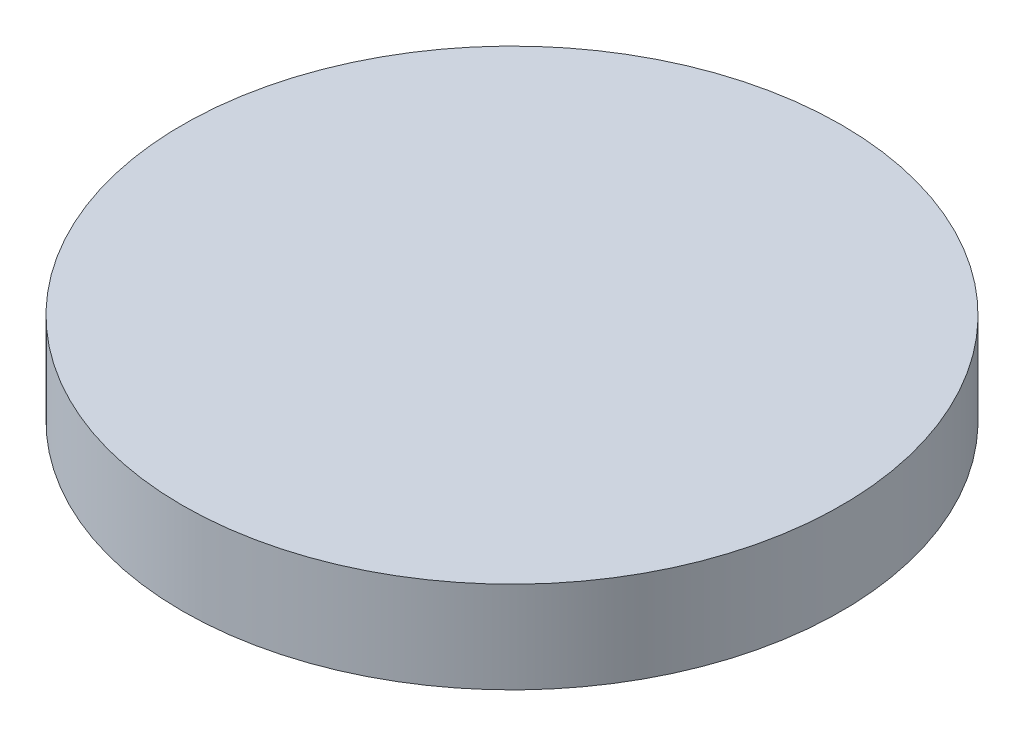
ISO-10303-21;
HEADER;
FILE_DESCRIPTION(('STEP AP214'),'2;1');
FILE_NAME('part.step','',(''),(''),'','','');
FILE_SCHEMA(('AUTOMOTIVE_DESIGN { 1 0 10303 214 1 1 1 1 }'));
ENDSEC;
DATA;
#1=APPLICATION_CONTEXT('core data for automotive mechanical design processes');
#2=APPLICATION_PROTOCOL_DEFINITION('international standard','automotive_design',2000,#1);
#3=PRODUCT_CONTEXT('',#1,'mechanical');
#4=PRODUCT('Part','Part','',(#3));
#5=PRODUCT_RELATED_PRODUCT_CATEGORY('part','',(#4));
#6=PRODUCT_DEFINITION_FORMATION('','',#4);
#7=PRODUCT_DEFINITION_CONTEXT('part definition',#1,'design');
#8=PRODUCT_DEFINITION('design','',#6,#7);
#9=PRODUCT_DEFINITION_SHAPE('','',#8);
#10=(LENGTH_UNIT() NAMED_UNIT(*) SI_UNIT(.MILLI.,.METRE.));
#11=(NAMED_UNIT(*) PLANE_ANGLE_UNIT() SI_UNIT($,.RADIAN.));
#12=(NAMED_UNIT(*) SI_UNIT($,.STERADIAN.) SOLID_ANGLE_UNIT());
#13=UNCERTAINTY_MEASURE_WITH_UNIT(LENGTH_MEASURE(1.E-05),#10,'distance_accuracy_value','');
#14=(GEOMETRIC_REPRESENTATION_CONTEXT(3) GLOBAL_UNCERTAINTY_ASSIGNED_CONTEXT((#13)) GLOBAL_UNIT_ASSIGNED_CONTEXT((#10,
#11,#12)) REPRESENTATION_CONTEXT('',''));
#15=CARTESIAN_POINT('',(0.,0.,0.));
#16=DIRECTION('',(0.,0.,1.));
#17=DIRECTION('',(1.,0.,0.));
#18=AXIS2_PLACEMENT_3D('',#15,#16,#17);
#19=CARTESIAN_POINT('',(0.,5.,0.));
#20=DIRECTION('',(0.,-1.,0.));
#21=DIRECTION('',(0.,0.,-1.));
#22=AXIS2_PLACEMENT_3D('',#19,#20,#21);
#23=CYLINDRICAL_SURFACE('',#22,18.);
#24=CARTESIAN_POINT('',(0.,5.,0.));
#25=DIRECTION('',(0.,1.,0.));
#26=DIRECTION('',(0.,0.,1.));
#27=AXIS2_PLACEMENT_3D('',#24,#25,#26);
#28=CIRCLE('',#27,18.);
#29=CARTESIAN_POINT('',(0.,5.,18.));
#30=VERTEX_POINT('',#29);
#31=EDGE_CURVE('E10',#30,#30,#28,.T.);
#32=ORIENTED_EDGE('',*,*,#31,.F.);
#33=EDGE_LOOP('',(#32));
#34=FACE_BOUND('',#33,.T.);
#35=CARTESIAN_POINT('',(0.,0.,0.));
#36=DIRECTION('',(0.,1.,0.));
#37=DIRECTION('',(0.,0.,1.));
#38=AXIS2_PLACEMENT_3D('',#35,#36,#37);
#39=CIRCLE('',#38,18.);
#40=CARTESIAN_POINT('',(0.,0.,18.));
#41=VERTEX_POINT('',#40);
#42=EDGE_CURVE('E40',#41,#41,#39,.T.);
#43=ORIENTED_EDGE('',*,*,#42,.T.);
#44=EDGE_LOOP('',(#43));
#45=FACE_BOUND('',#44,.T.);
#46=ADVANCED_FACE('F37',(#34,#45),#23,.T.);
#47=CARTESIAN_POINT('',(0.,5.,0.));
#48=DIRECTION('',(0.,1.,0.));
#49=DIRECTION('',(0.,0.,1.));
#50=AXIS2_PLACEMENT_3D('',#47,#48,#49);
#51=PLANE('',#50);
#52=ORIENTED_EDGE('',*,*,#31,.T.);
#53=EDGE_LOOP('',(#52));
#54=FACE_BOUND('',#53,.T.);
#55=ADVANCED_FACE('F54',(#54),#51,.T.);
#56=CARTESIAN_POINT('',(0.,0.,0.));
#57=DIRECTION('',(0.,1.,0.));
#58=DIRECTION('',(0.,0.,1.));
#59=AXIS2_PLACEMENT_3D('',#56,#57,#58);
#60=PLANE('',#59);
#61=ORIENTED_EDGE('',*,*,#42,.F.);
#62=EDGE_LOOP('',(#61));
#63=FACE_BOUND('',#62,.T.);
#64=ADVANCED_FACE('F52',(#63),#60,.F.);
#65=CLOSED_SHELL('',(#46,#55,#64));
#66=MANIFOLD_SOLID_BREP('B2',#65);
#67=ADVANCED_BREP_SHAPE_REPRESENTATION('',(#18,#66),#14);
#68=SHAPE_DEFINITION_REPRESENTATION(#9,#67);
ENDSEC;
END-ISO-10303-21;
